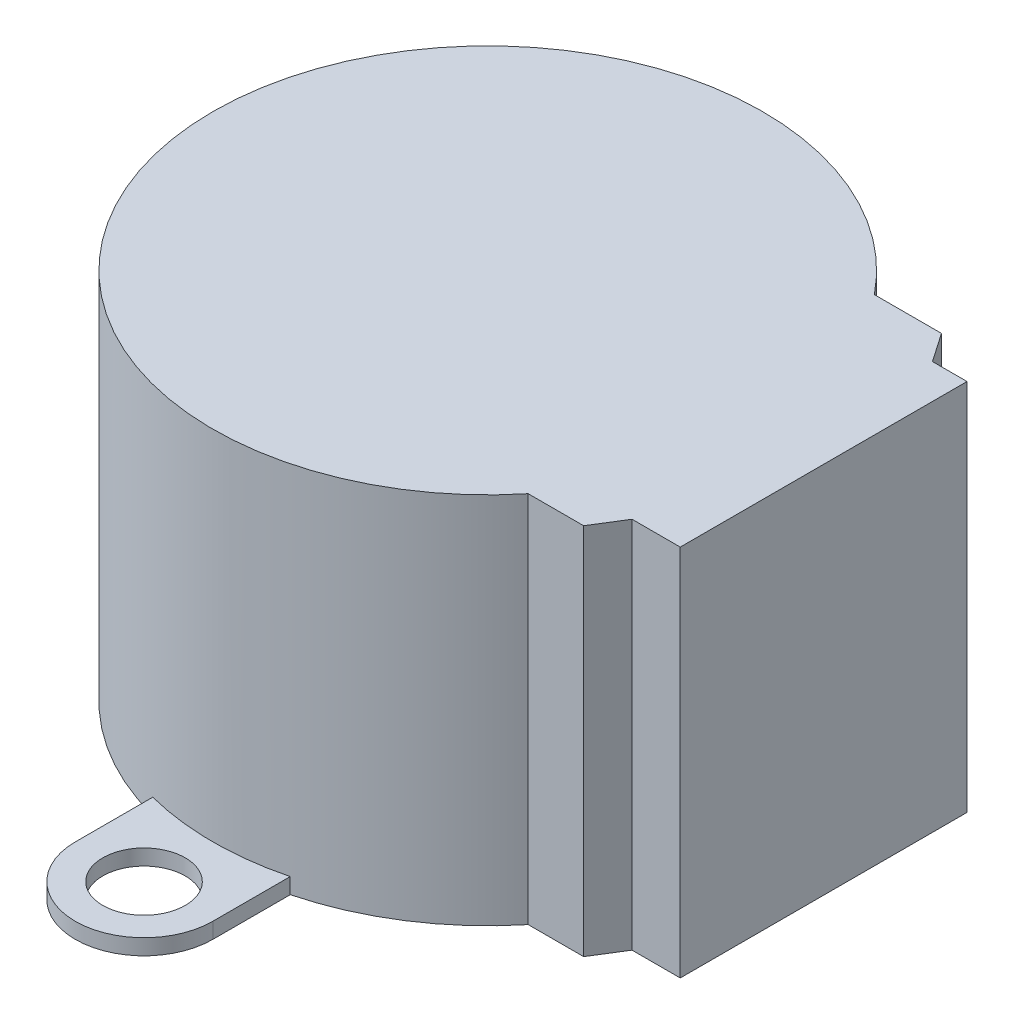
ISO-10303-21;
HEADER;
FILE_DESCRIPTION(('STEP AP214'),'2;1');
FILE_NAME('part.step','',(''),(''),'','','');
FILE_SCHEMA(('AUTOMOTIVE_DESIGN { 1 0 10303 214 1 1 1 1 }'));
ENDSEC;
DATA;
#1=APPLICATION_CONTEXT('core data for automotive mechanical design processes');
#2=APPLICATION_PROTOCOL_DEFINITION('international standard','automotive_design',2000,#1);
#3=PRODUCT_CONTEXT('',#1,'mechanical');
#4=PRODUCT('Part','Part','',(#3));
#5=PRODUCT_RELATED_PRODUCT_CATEGORY('part','',(#4));
#6=PRODUCT_DEFINITION_FORMATION('','',#4);
#7=PRODUCT_DEFINITION_CONTEXT('part definition',#1,'design');
#8=PRODUCT_DEFINITION('design','',#6,#7);
#9=PRODUCT_DEFINITION_SHAPE('','',#8);
#10=(LENGTH_UNIT() NAMED_UNIT(*) SI_UNIT(.MILLI.,.METRE.));
#11=(NAMED_UNIT(*) PLANE_ANGLE_UNIT() SI_UNIT($,.RADIAN.));
#12=(NAMED_UNIT(*) SI_UNIT($,.STERADIAN.) SOLID_ANGLE_UNIT());
#13=UNCERTAINTY_MEASURE_WITH_UNIT(LENGTH_MEASURE(1.E-05),#10,'distance_accuracy_value','');
#14=(GEOMETRIC_REPRESENTATION_CONTEXT(3) GLOBAL_UNCERTAINTY_ASSIGNED_CONTEXT((#13)) GLOBAL_UNIT_ASSIGNED_CONTEXT((#10,
#11,#12)) REPRESENTATION_CONTEXT('',''));
#15=CARTESIAN_POINT('',(0.,0.,0.));
#16=DIRECTION('',(0.,0.,1.));
#17=DIRECTION('',(1.,0.,0.));
#18=AXIS2_PLACEMENT_3D('',#15,#16,#17);
#19=CARTESIAN_POINT('',(0.,-4.,0.));
#20=DIRECTION('',(0.,1.,0.));
#21=DIRECTION('',(0.,0.,1.));
#22=AXIS2_PLACEMENT_3D('',#19,#20,#21);
#23=PLANE('',#22);
#24=CARTESIAN_POINT('',(-8.,-4.,0.));
#25=DIRECTION('',(0.,1.,0.));
#26=DIRECTION('',(0.,0.,1.));
#27=AXIS2_PLACEMENT_3D('',#24,#25,#26);
#28=CIRCLE('',#27,2.5);
#29=CARTESIAN_POINT('',(-6.98320476329011,-4.,-2.28388428923273));
#30=VERTEX_POINT('',#29);
#31=CARTESIAN_POINT('',(-9.01679523670988,-4.,-2.28388428923273));
#32=VERTEX_POINT('',#31);
#33=EDGE_CURVE('E216',#30,#32,#28,.T.);
#34=ORIENTED_EDGE('',*,*,#33,.F.);
#35=DIRECTION('',(1.,0.,0.));
#36=VECTOR('',#35,1.);
#37=CARTESIAN_POINT('',(-10.1451436156727,-4.,-2.28388428923273));
#38=LINE('',#37,#36);
#39=EDGE_CURVE('E55',#30,#32,#38,.F.);
#40=ORIENTED_EDGE('',*,*,#39,.T.);
#41=EDGE_LOOP('',(#34,#40));
#42=FACE_BOUND('',#41,.T.);
#43=ADVANCED_FACE('F36',(#42),#23,.F.);
#44=CARTESIAN_POINT('',(0.,19.,0.));
#45=DIRECTION('',(0.,-1.,0.));
#46=DIRECTION('',(0.,0.,-1.));
#47=AXIS2_PLACEMENT_3D('',#44,#45,#46);
#48=CYLINDRICAL_SURFACE('',#47,14.);
#49=CARTESIAN_POINT('',(0.,0.,0.));
#50=DIRECTION('',(0.,1.,0.));
#51=DIRECTION('',(0.,0.,1.));
#52=AXIS2_PLACEMENT_3D('',#49,#50,#51);
#53=CIRCLE('',#52,14.);
#54=CARTESIAN_POINT('',(-3.49999999999999,0.,-13.555441711726));
#55=VERTEX_POINT('',#54);
#56=CARTESIAN_POINT('',(-3.49999999999999,0.,13.555441711726));
#57=VERTEX_POINT('',#56);
#58=EDGE_CURVE('E413',#55,#57,#53,.T.);
#59=ORIENTED_EDGE('',*,*,#58,.T.);
#60=DIRECTION('',(0.,-1.,0.));
#61=VECTOR('',#60,1.);
#62=CARTESIAN_POINT('',(-3.49999999999999,0.8,13.555441711726));
#63=LINE('',#62,#61);
#64=CARTESIAN_POINT('',(-3.49999999999999,0.799999999999999,13.555441711726));
#65=VERTEX_POINT('',#64);
#66=EDGE_CURVE('E485',#65,#57,#63,.T.);
#67=ORIENTED_EDGE('',*,*,#66,.F.);
#68=CARTESIAN_POINT('',(0.,0.8,0.));
#69=DIRECTION('',(0.,1.,0.));
#70=DIRECTION('',(0.,0.,1.));
#71=AXIS2_PLACEMENT_3D('',#68,#69,#70);
#72=CIRCLE('',#71,14.);
#73=CARTESIAN_POINT('',(3.5,0.799999999999999,13.555441711726));
#74=VERTEX_POINT('',#73);
#75=EDGE_CURVE('E488',#65,#74,#72,.T.);
#76=ORIENTED_EDGE('',*,*,#75,.T.);
#77=DIRECTION('',(0.,-1.,0.));
#78=VECTOR('',#77,1.);
#79=CARTESIAN_POINT('',(3.5,0.8,13.555441711726));
#80=LINE('',#79,#78);
#81=CARTESIAN_POINT('',(3.5,0.,13.555441711726));
#82=VERTEX_POINT('',#81);
#83=EDGE_CURVE('E482',#74,#82,#80,.T.);
#84=ORIENTED_EDGE('',*,*,#83,.T.);
#85=CARTESIAN_POINT('',(10.8743002323448,0.,8.81757304800058));
#86=VERTEX_POINT('',#85);
#87=EDGE_CURVE('E414',#82,#86,#53,.T.);
#88=ORIENTED_EDGE('',*,*,#87,.T.);
#89=DIRECTION('',(0.,-1.,0.));
#90=VECTOR('',#89,1.);
#91=CARTESIAN_POINT('',(10.8743002323448,19.,8.81757304800058));
#92=LINE('',#91,#90);
#93=CARTESIAN_POINT('',(10.8743002323448,19.,8.81757304800058));
#94=VERTEX_POINT('',#93);
#95=EDGE_CURVE('E231',#94,#86,#92,.T.);
#96=ORIENTED_EDGE('',*,*,#95,.F.);
#97=CARTESIAN_POINT('',(0.,19.,0.));
#98=DIRECTION('',(0.,1.,0.));
#99=DIRECTION('',(0.,0.,1.));
#100=AXIS2_PLACEMENT_3D('',#97,#98,#99);
#101=CIRCLE('',#100,14.);
#102=CARTESIAN_POINT('',(10.9116716316614,19.,-8.77128395406261));
#103=VERTEX_POINT('',#102);
#104=EDGE_CURVE('E394',#103,#94,#101,.T.);
#105=ORIENTED_EDGE('',*,*,#104,.F.);
#106=DIRECTION('',(0.,-1.,0.));
#107=VECTOR('',#106,1.);
#108=CARTESIAN_POINT('',(10.9116716316614,19.,-8.77128395406261));
#109=LINE('',#108,#107);
#110=CARTESIAN_POINT('',(10.9116716316614,0.,-8.77128395406261));
#111=VERTEX_POINT('',#110);
#112=EDGE_CURVE('E388',#103,#111,#109,.T.);
#113=ORIENTED_EDGE('',*,*,#112,.T.);
#114=CARTESIAN_POINT('',(3.5,0.,-13.555441711726));
#115=VERTEX_POINT('',#114);
#116=EDGE_CURVE('E411',#111,#115,#53,.T.);
#117=ORIENTED_EDGE('',*,*,#116,.T.);
#118=DIRECTION('',(0.,-1.,0.));
#119=VECTOR('',#118,1.);
#120=CARTESIAN_POINT('',(3.5,0.8,-13.555441711726));
#121=LINE('',#120,#119);
#122=CARTESIAN_POINT('',(3.5,0.799999999999999,-13.555441711726));
#123=VERTEX_POINT('',#122);
#124=EDGE_CURVE('E448',#123,#115,#121,.T.);
#125=ORIENTED_EDGE('',*,*,#124,.F.);
#126=CARTESIAN_POINT('',(0.,0.8,0.));
#127=DIRECTION('',(0.,1.,0.));
#128=DIRECTION('',(0.,0.,1.));
#129=AXIS2_PLACEMENT_3D('',#126,#127,#128);
#130=CIRCLE('',#129,14.);
#131=CARTESIAN_POINT('',(-3.49999999999999,0.799999999999999,-13.555441711726));
#132=VERTEX_POINT('',#131);
#133=EDGE_CURVE('E451',#123,#132,#130,.T.);
#134=ORIENTED_EDGE('',*,*,#133,.T.);
#135=DIRECTION('',(0.,-1.,0.));
#136=VECTOR('',#135,1.);
#137=CARTESIAN_POINT('',(-3.49999999999999,0.8,-13.555441711726));
#138=LINE('',#137,#136);
#139=EDGE_CURVE('E445',#132,#55,#138,.T.);
#140=ORIENTED_EDGE('',*,*,#139,.T.);
#141=EDGE_LOOP('',(#59,#67,#76,#84,#88,#96,#105,#113,#117,#125,#134,#140));
#142=FACE_BOUND('',#141,.T.);
#143=ADVANCED_FACE('F268',(#142),#48,.T.);
#144=CARTESIAN_POINT('',(0.,19.,8.81757304800058));
#145=DIRECTION('',(0.,0.,-1.));
#146=DIRECTION('',(-1.,0.,0.));
#147=AXIS2_PLACEMENT_3D('',#144,#145,#146);
#148=PLANE('',#147);
#149=DIRECTION('',(1.,0.,0.));
#150=VECTOR('',#149,1.);
#151=CARTESIAN_POINT('',(0.,0.,8.81757304800058));
#152=LINE('',#151,#150);
#153=CARTESIAN_POINT('',(13.7006228905011,0.,8.81757304800058));
#154=VERTEX_POINT('',#153);
#155=EDGE_CURVE('E409',#86,#154,#152,.T.);
#156=ORIENTED_EDGE('',*,*,#155,.T.);
#157=DIRECTION('',(0.,-1.,0.));
#158=VECTOR('',#157,1.);
#159=CARTESIAN_POINT('',(13.7006228905011,19.,8.81757304800058));
#160=LINE('',#159,#158);
#161=CARTESIAN_POINT('',(13.7006228905011,19.,8.81757304800058));
#162=VERTEX_POINT('',#161);
#163=EDGE_CURVE('E370',#162,#154,#160,.T.);
#164=ORIENTED_EDGE('',*,*,#163,.F.);
#165=DIRECTION('',(1.,0.,0.));
#166=VECTOR('',#165,1.);
#167=CARTESIAN_POINT('',(0.,19.,8.81757304800058));
#168=LINE('',#167,#166);
#169=EDGE_CURVE('E430',#94,#162,#168,.T.);
#170=ORIENTED_EDGE('',*,*,#169,.F.);
#171=ORIENTED_EDGE('',*,*,#95,.T.);
#172=EDGE_LOOP('',(#156,#164,#170,#171));
#173=FACE_BOUND('',#172,.T.);
#174=ADVANCED_FACE('F272',(#173),#148,.F.);
#175=CARTESIAN_POINT('',(13.8310384443129,19.,8.60802646423938));
#176=DIRECTION('',(-0.849000236853081,0.,-0.528392465714087));
#177=DIRECTION('',(-0.528392465714087,0.,0.849000236853081));
#178=AXIS2_PLACEMENT_3D('',#175,#176,#177);
#179=PLANE('',#178);
#180=DIRECTION('',(0.528392465714087,0.,-0.849000236853081));
#181=VECTOR('',#180,1.);
#182=CARTESIAN_POINT('',(13.8310384443129,0.,8.60802646423938));
#183=LINE('',#182,#181);
#184=CARTESIAN_POINT('',(14.645115164975,0.,7.3));
#185=VERTEX_POINT('',#184);
#186=EDGE_CURVE('E407',#154,#185,#183,.T.);
#187=ORIENTED_EDGE('',*,*,#186,.T.);
#188=DIRECTION('',(0.,-1.,0.));
#189=VECTOR('',#188,1.);
#190=CARTESIAN_POINT('',(14.645115164975,19.,7.3));
#191=LINE('',#190,#189);
#192=CARTESIAN_POINT('',(14.645115164975,19.,7.3));
#193=VERTEX_POINT('',#192);
#194=EDGE_CURVE('E373',#193,#185,#191,.T.);
#195=ORIENTED_EDGE('',*,*,#194,.F.);
#196=DIRECTION('',(0.528392465714087,0.,-0.849000236853081));
#197=VECTOR('',#196,1.);
#198=CARTESIAN_POINT('',(13.8310384443129,19.,8.60802646423938));
#199=LINE('',#198,#197);
#200=EDGE_CURVE('E428',#162,#193,#199,.T.);
#201=ORIENTED_EDGE('',*,*,#200,.F.);
#202=ORIENTED_EDGE('',*,*,#163,.T.);
#203=EDGE_LOOP('',(#187,#195,#201,#202));
#204=FACE_BOUND('',#203,.T.);
#205=ADVANCED_FACE('F276',(#204),#179,.F.);
#206=CARTESIAN_POINT('',(0.,19.,7.3));
#207=DIRECTION('',(0.,0.,-1.));
#208=DIRECTION('',(-1.,0.,0.));
#209=AXIS2_PLACEMENT_3D('',#206,#207,#208);
#210=PLANE('',#209);
#211=DIRECTION('',(1.,0.,0.));
#212=VECTOR('',#211,1.);
#213=CARTESIAN_POINT('',(0.,0.,7.3));
#214=LINE('',#213,#212);
#215=CARTESIAN_POINT('',(17.1,0.,7.3));
#216=VERTEX_POINT('',#215);
#217=EDGE_CURVE('E404',#185,#216,#214,.T.);
#218=ORIENTED_EDGE('',*,*,#217,.T.);
#219=DIRECTION('',(0.,-1.,0.));
#220=VECTOR('',#219,1.);
#221=CARTESIAN_POINT('',(17.1,19.,7.3));
#222=LINE('',#221,#220);
#223=CARTESIAN_POINT('',(17.1,19.,7.3));
#224=VERTEX_POINT('',#223);
#225=EDGE_CURVE('E378',#224,#216,#222,.T.);
#226=ORIENTED_EDGE('',*,*,#225,.F.);
#227=DIRECTION('',(1.,0.,0.));
#228=VECTOR('',#227,1.);
#229=CARTESIAN_POINT('',(0.,19.,7.3));
#230=LINE('',#229,#228);
#231=EDGE_CURVE('E426',#193,#224,#230,.T.);
#232=ORIENTED_EDGE('',*,*,#231,.F.);
#233=ORIENTED_EDGE('',*,*,#194,.T.);
#234=EDGE_LOOP('',(#218,#226,#232,#233));
#235=FACE_BOUND('',#234,.T.);
#236=ADVANCED_FACE('F280',(#235),#210,.F.);
#237=CARTESIAN_POINT('',(17.1,19.,0.));
#238=DIRECTION('',(1.,0.,0.));
#239=DIRECTION('',(0.,0.,-1.));
#240=AXIS2_PLACEMENT_3D('',#237,#238,#239);
#241=PLANE('',#240);
#242=DIRECTION('',(0.,0.,1.));
#243=VECTOR('',#242,1.);
#244=CARTESIAN_POINT('',(17.1,0.,0.));
#245=LINE('',#244,#243);
#246=CARTESIAN_POINT('',(17.1,0.,-7.3));
#247=VERTEX_POINT('',#246);
#248=EDGE_CURVE('E401',#247,#216,#245,.T.);
#249=ORIENTED_EDGE('',*,*,#248,.F.);
#250=DIRECTION('',(0.,-1.,0.));
#251=VECTOR('',#250,1.);
#252=CARTESIAN_POINT('',(17.1,19.,-7.3));
#253=LINE('',#252,#251);
#254=CARTESIAN_POINT('',(17.1,19.,-7.3));
#255=VERTEX_POINT('',#254);
#256=EDGE_CURVE('E382',#255,#247,#253,.T.);
#257=ORIENTED_EDGE('',*,*,#256,.F.);
#258=DIRECTION('',(0.,0.,1.));
#259=VECTOR('',#258,1.);
#260=CARTESIAN_POINT('',(17.1,19.,0.));
#261=LINE('',#260,#259);
#262=EDGE_CURVE('E423',#255,#224,#261,.T.);
#263=ORIENTED_EDGE('',*,*,#262,.T.);
#264=ORIENTED_EDGE('',*,*,#225,.T.);
#265=EDGE_LOOP('',(#249,#257,#263,#264));
#266=FACE_BOUND('',#265,.T.);
#267=ADVANCED_FACE('F284',(#266),#241,.T.);
#268=CARTESIAN_POINT('',(0.,19.,-7.3));
#269=DIRECTION('',(0.,0.,-1.));
#270=DIRECTION('',(-1.,0.,0.));
#271=AXIS2_PLACEMENT_3D('',#268,#269,#270);
#272=PLANE('',#271);
#273=DIRECTION('',(1.,0.,0.));
#274=VECTOR('',#273,1.);
#275=CARTESIAN_POINT('',(0.,0.,-7.3));
#276=LINE('',#275,#274);
#277=CARTESIAN_POINT('',(15.3419038986928,0.,-7.3));
#278=VERTEX_POINT('',#277);
#279=EDGE_CURVE('E398',#278,#247,#276,.T.);
#280=ORIENTED_EDGE('',*,*,#279,.F.);
#281=DIRECTION('',(0.,-1.,0.));
#282=VECTOR('',#281,1.);
#283=CARTESIAN_POINT('',(15.3419038986928,19.,-7.3));
#284=LINE('',#283,#282);
#285=CARTESIAN_POINT('',(15.3419038986928,19.,-7.3));
#286=VERTEX_POINT('',#285);
#287=EDGE_CURVE('E384',#286,#278,#284,.T.);
#288=ORIENTED_EDGE('',*,*,#287,.F.);
#289=DIRECTION('',(1.,0.,0.));
#290=VECTOR('',#289,1.);
#291=CARTESIAN_POINT('',(0.,19.,-7.3));
#292=LINE('',#291,#290);
#293=EDGE_CURVE('E420',#286,#255,#292,.T.);
#294=ORIENTED_EDGE('',*,*,#293,.T.);
#295=ORIENTED_EDGE('',*,*,#256,.T.);
#296=EDGE_LOOP('',(#280,#288,#294,#295));
#297=FACE_BOUND('',#296,.T.);
#298=ADVANCED_FACE('F288',(#297),#272,.T.);
#299=CARTESIAN_POINT('',(13.8064040561496,19.,-9.52556220750878));
#300=DIRECTION('',(0.823103986409762,0.,-0.567890682751847));
#301=DIRECTION('',(-0.567890682751847,0.,-0.823103986409762));
#302=AXIS2_PLACEMENT_3D('',#299,#300,#301);
#303=PLANE('',#302);
#304=DIRECTION('',(0.567890682751847,0.,0.823103986409762));
#305=VECTOR('',#304,1.);
#306=CARTESIAN_POINT('',(13.8064040561496,0.,-9.52556220750878));
#307=LINE('',#306,#305);
#308=CARTESIAN_POINT('',(14.326809253314,0.,-8.77128395406261));
#309=VERTEX_POINT('',#308);
#310=EDGE_CURVE('E395',#309,#278,#307,.T.);
#311=ORIENTED_EDGE('',*,*,#310,.F.);
#312=DIRECTION('',(0.,-1.,0.));
#313=VECTOR('',#312,1.);
#314=CARTESIAN_POINT('',(14.326809253314,19.,-8.77128395406261));
#315=LINE('',#314,#313);
#316=CARTESIAN_POINT('',(14.326809253314,19.,-8.77128395406261));
#317=VERTEX_POINT('',#316);
#318=EDGE_CURVE('E386',#317,#309,#315,.T.);
#319=ORIENTED_EDGE('',*,*,#318,.F.);
#320=DIRECTION('',(0.567890682751847,0.,0.823103986409762));
#321=VECTOR('',#320,1.);
#322=CARTESIAN_POINT('',(13.8064040561496,19.,-9.52556220750878));
#323=LINE('',#322,#321);
#324=EDGE_CURVE('E417',#317,#286,#323,.T.);
#325=ORIENTED_EDGE('',*,*,#324,.T.);
#326=ORIENTED_EDGE('',*,*,#287,.T.);
#327=EDGE_LOOP('',(#311,#319,#325,#326));
#328=FACE_BOUND('',#327,.T.);
#329=ADVANCED_FACE('F292',(#328),#303,.T.);
#330=CARTESIAN_POINT('',(0.,19.,-8.77128395406261));
#331=DIRECTION('',(0.,0.,-1.));
#332=DIRECTION('',(-1.,0.,0.));
#333=AXIS2_PLACEMENT_3D('',#330,#331,#332);
#334=PLANE('',#333);
#335=DIRECTION('',(1.,0.,0.));
#336=VECTOR('',#335,1.);
#337=CARTESIAN_POINT('',(0.,0.,-8.77128395406261));
#338=LINE('',#337,#336);
#339=EDGE_CURVE('E391',#111,#309,#338,.T.);
#340=ORIENTED_EDGE('',*,*,#339,.F.);
#341=ORIENTED_EDGE('',*,*,#112,.F.);
#342=DIRECTION('',(1.,0.,0.));
#343=VECTOR('',#342,1.);
#344=CARTESIAN_POINT('',(0.,19.,-8.77128395406261));
#345=LINE('',#344,#343);
#346=EDGE_CURVE('E390',#103,#317,#345,.T.);
#347=ORIENTED_EDGE('',*,*,#346,.T.);
#348=ORIENTED_EDGE('',*,*,#318,.T.);
#349=EDGE_LOOP('',(#340,#341,#347,#348));
#350=FACE_BOUND('',#349,.T.);
#351=ADVANCED_FACE('F296',(#350),#334,.T.);
#352=CARTESIAN_POINT('',(0.,19.,0.));
#353=DIRECTION('',(0.,1.,0.));
#354=DIRECTION('',(0.,0.,1.));
#355=AXIS2_PLACEMENT_3D('',#352,#353,#354);
#356=PLANE('',#355);
#357=ORIENTED_EDGE('',*,*,#104,.T.);
#358=ORIENTED_EDGE('',*,*,#169,.T.);
#359=ORIENTED_EDGE('',*,*,#200,.T.);
#360=ORIENTED_EDGE('',*,*,#231,.T.);
#361=ORIENTED_EDGE('',*,*,#262,.F.);
#362=ORIENTED_EDGE('',*,*,#293,.F.);
#363=ORIENTED_EDGE('',*,*,#324,.F.);
#364=ORIENTED_EDGE('',*,*,#346,.F.);
#365=EDGE_LOOP('',(#357,#358,#359,#360,#361,#362,#363,#364));
#366=FACE_BOUND('',#365,.T.);
#367=ADVANCED_FACE('F300',(#366),#356,.T.);
#368=CARTESIAN_POINT('',(0.,0.,0.));
#369=DIRECTION('',(0.,1.,0.));
#370=DIRECTION('',(0.,0.,1.));
#371=AXIS2_PLACEMENT_3D('',#368,#369,#370);
#372=PLANE('',#371);
#373=CARTESIAN_POINT('',(-8.,0.,0.));
#374=DIRECTION('',(0.,1.,0.));
#375=DIRECTION('',(0.,0.,1.));
#376=AXIS2_PLACEMENT_3D('',#373,#374,#375);
#377=CIRCLE('',#376,4.5);
#378=CARTESIAN_POINT('',(-8.,0.,4.5));
#379=VERTEX_POINT('',#378);
#380=EDGE_CURVE('E434',#379,#379,#377,.T.);
#381=ORIENTED_EDGE('',*,*,#380,.T.);
#382=EDGE_LOOP('',(#381));
#383=FACE_BOUND('',#382,.T.);
#384=ORIENTED_EDGE('',*,*,#116,.F.);
#385=ORIENTED_EDGE('',*,*,#339,.T.);
#386=ORIENTED_EDGE('',*,*,#310,.T.);
#387=ORIENTED_EDGE('',*,*,#279,.T.);
#388=ORIENTED_EDGE('',*,*,#248,.T.);
#389=ORIENTED_EDGE('',*,*,#217,.F.);
#390=ORIENTED_EDGE('',*,*,#186,.F.);
#391=ORIENTED_EDGE('',*,*,#155,.F.);
#392=ORIENTED_EDGE('',*,*,#87,.F.);
#393=DIRECTION('',(0.,0.,-1.));
#394=VECTOR('',#393,1.);
#395=CARTESIAN_POINT('',(3.5,0.,0.));
#396=LINE('',#395,#394);
#397=CARTESIAN_POINT('',(3.5,0.,17.5));
#398=VERTEX_POINT('',#397);
#399=EDGE_CURVE('E489',#398,#82,#396,.T.);
#400=ORIENTED_EDGE('',*,*,#399,.F.);
#401=CARTESIAN_POINT('',(0.,0.,17.5));
#402=DIRECTION('',(0.,1.,0.));
#403=DIRECTION('',(0.,0.,1.));
#404=AXIS2_PLACEMENT_3D('',#401,#402,#403);
#405=CIRCLE('',#404,3.5);
#406=CARTESIAN_POINT('',(-3.49999999999999,0.,17.5));
#407=VERTEX_POINT('',#406);
#408=EDGE_CURVE('E492',#407,#398,#405,.T.);
#409=ORIENTED_EDGE('',*,*,#408,.F.);
#410=DIRECTION('',(0.,0.,-1.));
#411=VECTOR('',#410,1.);
#412=CARTESIAN_POINT('',(-3.49999999999999,0.,0.));
#413=LINE('',#412,#411);
#414=EDGE_CURVE('E495',#407,#57,#413,.T.);
#415=ORIENTED_EDGE('',*,*,#414,.T.);
#416=ORIENTED_EDGE('',*,*,#58,.F.);
#417=DIRECTION('',(0.,0.,1.));
#418=VECTOR('',#417,1.);
#419=CARTESIAN_POINT('',(-3.49999999999997,0.,0.));
#420=LINE('',#419,#418);
#421=CARTESIAN_POINT('',(-3.5,0.,-17.5));
#422=VERTEX_POINT('',#421);
#423=EDGE_CURVE('E452',#422,#55,#420,.T.);
#424=ORIENTED_EDGE('',*,*,#423,.F.);
#425=CARTESIAN_POINT('',(0.,0.,-17.5));
#426=DIRECTION('',(0.,1.,0.));
#427=DIRECTION('',(0.,0.,1.));
#428=AXIS2_PLACEMENT_3D('',#425,#426,#427);
#429=CIRCLE('',#428,3.5);
#430=CARTESIAN_POINT('',(3.5,0.,-17.5));
#431=VERTEX_POINT('',#430);
#432=EDGE_CURVE('E456',#431,#422,#429,.T.);
#433=ORIENTED_EDGE('',*,*,#432,.F.);
#434=DIRECTION('',(0.,0.,1.));
#435=VECTOR('',#434,1.);
#436=CARTESIAN_POINT('',(3.5,0.,0.));
#437=LINE('',#436,#435);
#438=EDGE_CURVE('E459',#431,#115,#437,.T.);
#439=ORIENTED_EDGE('',*,*,#438,.T.);
#440=EDGE_LOOP('',(#384,#385,#386,#387,#388,#389,#390,#391,#392,#400,#409,#415,#416,#424,#433,#439));
#441=FACE_BOUND('',#440,.T.);
#442=CARTESIAN_POINT('',(0.,0.,-17.5));
#443=DIRECTION('',(0.,1.,0.));
#444=DIRECTION('',(0.,0.,1.));
#445=AXIS2_PLACEMENT_3D('',#442,#443,#444);
#446=CIRCLE('',#445,2.1);
#447=CARTESIAN_POINT('',(0.,0.,-15.4));
#448=VERTEX_POINT('',#447);
#449=EDGE_CURVE('E462',#448,#448,#446,.T.);
#450=ORIENTED_EDGE('',*,*,#449,.T.);
#451=EDGE_LOOP('',(#450));
#452=FACE_BOUND('',#451,.T.);
#453=CARTESIAN_POINT('',(0.,0.,17.5));
#454=DIRECTION('',(0.,1.,0.));
#455=DIRECTION('',(0.,0.,1.));
#456=AXIS2_PLACEMENT_3D('',#453,#454,#455);
#457=CIRCLE('',#456,2.1);
#458=CARTESIAN_POINT('',(0.,0.,19.6));
#459=VERTEX_POINT('',#458);
#460=EDGE_CURVE('E498',#459,#459,#457,.T.);
#461=ORIENTED_EDGE('',*,*,#460,.T.);
#462=EDGE_LOOP('',(#461));
#463=FACE_BOUND('',#462,.T.);
#464=ADVANCED_FACE('F302',(#383,#441,#452,#463),#372,.F.);
#465=CARTESIAN_POINT('',(-8.,-1.6,0.));
#466=DIRECTION('',(0.,1.,0.));
#467=DIRECTION('',(0.,0.,1.));
#468=AXIS2_PLACEMENT_3D('',#465,#466,#467);
#469=CYLINDRICAL_SURFACE('',#468,4.5);
#470=CARTESIAN_POINT('',(-8.,-1.6,0.));
#471=DIRECTION('',(0.,1.,0.));
#472=DIRECTION('',(0.,0.,1.));
#473=AXIS2_PLACEMENT_3D('',#470,#471,#472);
#474=CIRCLE('',#473,4.5);
#475=CARTESIAN_POINT('',(-8.,-1.6,4.5));
#476=VERTEX_POINT('',#475);
#477=EDGE_CURVE('E437',#476,#476,#474,.T.);
#478=ORIENTED_EDGE('',*,*,#477,.T.);
#479=EDGE_LOOP('',(#478));
#480=FACE_BOUND('',#479,.T.);
#481=ORIENTED_EDGE('',*,*,#380,.F.);
#482=EDGE_LOOP('',(#481));
#483=FACE_BOUND('',#482,.T.);
#484=ADVANCED_FACE('F305',(#480,#483),#469,.T.);
#485=CARTESIAN_POINT('',(0.,-1.6,0.));
#486=DIRECTION('',(0.,1.,0.));
#487=DIRECTION('',(0.,0.,1.));
#488=AXIS2_PLACEMENT_3D('',#485,#486,#487);
#489=PLANE('',#488);
#490=CARTESIAN_POINT('',(-8.,-1.6,0.));
#491=DIRECTION('',(0.,1.,0.));
#492=DIRECTION('',(0.,0.,1.));
#493=AXIS2_PLACEMENT_3D('',#490,#491,#492);
#494=CIRCLE('',#493,2.5);
#495=CARTESIAN_POINT('',(-8.,-1.6,2.5));
#496=VERTEX_POINT('',#495);
#497=EDGE_CURVE('E238',#496,#496,#494,.T.);
#498=ORIENTED_EDGE('',*,*,#497,.T.);
#499=EDGE_LOOP('',(#498));
#500=FACE_BOUND('',#499,.T.);
#501=ORIENTED_EDGE('',*,*,#477,.F.);
#502=EDGE_LOOP('',(#501));
#503=FACE_BOUND('',#502,.T.);
#504=ADVANCED_FACE('F312',(#500,#503),#489,.F.);
#505=CARTESIAN_POINT('',(3.5,0.8,0.));
#506=DIRECTION('',(1.,0.,0.));
#507=DIRECTION('',(0.,0.,-1.));
#508=AXIS2_PLACEMENT_3D('',#505,#506,#507);
#509=PLANE('',#508);
#510=ORIENTED_EDGE('',*,*,#438,.F.);
#511=DIRECTION('',(0.,-1.,0.));
#512=VECTOR('',#511,1.);
#513=CARTESIAN_POINT('',(3.5,0.8,-17.5));
#514=LINE('',#513,#512);
#515=CARTESIAN_POINT('',(3.5,0.8,-17.5));
#516=VERTEX_POINT('',#515);
#517=EDGE_CURVE('E438',#516,#431,#514,.T.);
#518=ORIENTED_EDGE('',*,*,#517,.F.);
#519=DIRECTION('',(0.,0.,1.));
#520=VECTOR('',#519,1.);
#521=CARTESIAN_POINT('',(3.5,0.8,0.));
#522=LINE('',#521,#520);
#523=EDGE_CURVE('E473',#516,#123,#522,.T.);
#524=ORIENTED_EDGE('',*,*,#523,.T.);
#525=ORIENTED_EDGE('',*,*,#124,.T.);
#526=EDGE_LOOP('',(#510,#518,#524,#525));
#527=FACE_BOUND('',#526,.T.);
#528=ADVANCED_FACE('F316',(#527),#509,.T.);
#529=CARTESIAN_POINT('',(0.,0.8,-17.5));
#530=DIRECTION('',(0.,-1.,0.));
#531=DIRECTION('',(0.,0.,-1.));
#532=AXIS2_PLACEMENT_3D('',#529,#530,#531);
#533=CYLINDRICAL_SURFACE('',#532,3.5);
#534=ORIENTED_EDGE('',*,*,#432,.T.);
#535=DIRECTION('',(0.,-1.,0.));
#536=VECTOR('',#535,1.);
#537=CARTESIAN_POINT('',(-3.5,0.8,-17.5));
#538=LINE('',#537,#536);
#539=CARTESIAN_POINT('',(-3.5,0.8,-17.5));
#540=VERTEX_POINT('',#539);
#541=EDGE_CURVE('E442',#540,#422,#538,.T.);
#542=ORIENTED_EDGE('',*,*,#541,.F.);
#543=CARTESIAN_POINT('',(0.,0.8,-17.5));
#544=DIRECTION('',(0.,1.,0.));
#545=DIRECTION('',(0.,0.,1.));
#546=AXIS2_PLACEMENT_3D('',#543,#544,#545);
#547=CIRCLE('',#546,3.5);
#548=EDGE_CURVE('E470',#516,#540,#547,.T.);
#549=ORIENTED_EDGE('',*,*,#548,.F.);
#550=ORIENTED_EDGE('',*,*,#517,.T.);
#551=EDGE_LOOP('',(#534,#542,#549,#550));
#552=FACE_BOUND('',#551,.T.);
#553=ADVANCED_FACE('F326',(#552),#533,.T.);
#554=CARTESIAN_POINT('',(-3.49999999999997,0.8,0.));
#555=DIRECTION('',(1.,0.,0.));
#556=DIRECTION('',(0.,0.,-1.));
#557=AXIS2_PLACEMENT_3D('',#554,#555,#556);
#558=PLANE('',#557);
#559=ORIENTED_EDGE('',*,*,#423,.T.);
#560=ORIENTED_EDGE('',*,*,#139,.F.);
#561=DIRECTION('',(0.,0.,1.));
#562=VECTOR('',#561,1.);
#563=CARTESIAN_POINT('',(-3.49999999999997,0.8,0.));
#564=LINE('',#563,#562);
#565=EDGE_CURVE('E467',#540,#132,#564,.T.);
#566=ORIENTED_EDGE('',*,*,#565,.F.);
#567=ORIENTED_EDGE('',*,*,#541,.T.);
#568=EDGE_LOOP('',(#559,#560,#566,#567));
#569=FACE_BOUND('',#568,.T.);
#570=ADVANCED_FACE('F322',(#569),#558,.F.);
#571=CARTESIAN_POINT('',(0.,0.8,-17.5));
#572=DIRECTION('',(0.,-1.,0.));
#573=DIRECTION('',(0.,0.,-1.));
#574=AXIS2_PLACEMENT_3D('',#571,#572,#573);
#575=CYLINDRICAL_SURFACE('',#574,2.1);
#576=CARTESIAN_POINT('',(0.,0.8,-17.5));
#577=DIRECTION('',(0.,1.,0.));
#578=DIRECTION('',(0.,0.,1.));
#579=AXIS2_PLACEMENT_3D('',#576,#577,#578);
#580=CIRCLE('',#579,2.1);
#581=CARTESIAN_POINT('',(0.,0.8,-15.4));
#582=VERTEX_POINT('',#581);
#583=EDGE_CURVE('E455',#582,#582,#580,.T.);
#584=ORIENTED_EDGE('',*,*,#583,.T.);
#585=EDGE_LOOP('',(#584));
#586=FACE_BOUND('',#585,.T.);
#587=ORIENTED_EDGE('',*,*,#449,.F.);
#588=EDGE_LOOP('',(#587));
#589=FACE_BOUND('',#588,.T.);
#590=ADVANCED_FACE('F318',(#586,#589),#575,.F.);
#591=CARTESIAN_POINT('',(0.,0.8,0.));
#592=DIRECTION('',(0.,1.,0.));
#593=DIRECTION('',(0.,0.,1.));
#594=AXIS2_PLACEMENT_3D('',#591,#592,#593);
#595=PLANE('',#594);
#596=ORIENTED_EDGE('',*,*,#583,.F.);
#597=EDGE_LOOP('',(#596));
#598=FACE_BOUND('',#597,.T.);
#599=ORIENTED_EDGE('',*,*,#523,.F.);
#600=ORIENTED_EDGE('',*,*,#548,.T.);
#601=ORIENTED_EDGE('',*,*,#565,.T.);
#602=ORIENTED_EDGE('',*,*,#133,.F.);
#603=EDGE_LOOP('',(#599,#600,#601,#602));
#604=FACE_BOUND('',#603,.T.);
#605=ADVANCED_FACE('F321',(#598,#604),#595,.T.);
#606=CARTESIAN_POINT('',(-3.49999999999999,0.8,0.));
#607=DIRECTION('',(-1.,0.,0.));
#608=DIRECTION('',(0.,0.,1.));
#609=AXIS2_PLACEMENT_3D('',#606,#607,#608);
#610=PLANE('',#609);
#611=ORIENTED_EDGE('',*,*,#414,.F.);
#612=DIRECTION('',(0.,-1.,0.));
#613=VECTOR('',#612,1.);
#614=CARTESIAN_POINT('',(-3.49999999999999,0.8,17.5));
#615=LINE('',#614,#613);
#616=CARTESIAN_POINT('',(-3.49999999999999,0.8,17.5));
#617=VERTEX_POINT('',#616);
#618=EDGE_CURVE('E465',#617,#407,#615,.T.);
#619=ORIENTED_EDGE('',*,*,#618,.F.);
#620=DIRECTION('',(0.,0.,-1.));
#621=VECTOR('',#620,1.);
#622=CARTESIAN_POINT('',(-3.49999999999999,0.8,0.));
#623=LINE('',#622,#621);
#624=EDGE_CURVE('E508',#617,#65,#623,.T.);
#625=ORIENTED_EDGE('',*,*,#624,.T.);
#626=ORIENTED_EDGE('',*,*,#66,.T.);
#627=EDGE_LOOP('',(#611,#619,#625,#626));
#628=FACE_BOUND('',#627,.T.);
#629=ADVANCED_FACE('F336',(#628),#610,.T.);
#630=CARTESIAN_POINT('',(0.,0.8,17.5));
#631=DIRECTION('',(0.,-1.,0.));
#632=DIRECTION('',(0.,0.,-1.));
#633=AXIS2_PLACEMENT_3D('',#630,#631,#632);
#634=CYLINDRICAL_SURFACE('',#633,3.5);
#635=ORIENTED_EDGE('',*,*,#408,.T.);
#636=DIRECTION('',(0.,-1.,0.));
#637=VECTOR('',#636,1.);
#638=CARTESIAN_POINT('',(3.5,0.8,17.5));
#639=LINE('',#638,#637);
#640=CARTESIAN_POINT('',(3.5,0.8,17.5));
#641=VERTEX_POINT('',#640);
#642=EDGE_CURVE('E479',#641,#398,#639,.T.);
#643=ORIENTED_EDGE('',*,*,#642,.F.);
#644=CARTESIAN_POINT('',(0.,0.8,17.5));
#645=DIRECTION('',(0.,1.,0.));
#646=DIRECTION('',(0.,0.,1.));
#647=AXIS2_PLACEMENT_3D('',#644,#645,#646);
#648=CIRCLE('',#647,3.5);
#649=EDGE_CURVE('E505',#617,#641,#648,.T.);
#650=ORIENTED_EDGE('',*,*,#649,.F.);
#651=ORIENTED_EDGE('',*,*,#618,.T.);
#652=EDGE_LOOP('',(#635,#643,#650,#651));
#653=FACE_BOUND('',#652,.T.);
#654=ADVANCED_FACE('F345',(#653),#634,.T.);
#655=CARTESIAN_POINT('',(3.5,0.8,0.));
#656=DIRECTION('',(-1.,0.,0.));
#657=DIRECTION('',(0.,0.,1.));
#658=AXIS2_PLACEMENT_3D('',#655,#656,#657);
#659=PLANE('',#658);
#660=ORIENTED_EDGE('',*,*,#399,.T.);
#661=ORIENTED_EDGE('',*,*,#83,.F.);
#662=DIRECTION('',(0.,0.,-1.));
#663=VECTOR('',#662,1.);
#664=CARTESIAN_POINT('',(3.5,0.8,0.));
#665=LINE('',#664,#663);
#666=EDGE_CURVE('E502',#641,#74,#665,.T.);
#667=ORIENTED_EDGE('',*,*,#666,.F.);
#668=ORIENTED_EDGE('',*,*,#642,.T.);
#669=EDGE_LOOP('',(#660,#661,#667,#668));
#670=FACE_BOUND('',#669,.T.);
#671=ADVANCED_FACE('F341',(#670),#659,.F.);
#672=CARTESIAN_POINT('',(0.,0.8,17.5));
#673=DIRECTION('',(0.,-1.,0.));
#674=DIRECTION('',(0.,0.,-1.));
#675=AXIS2_PLACEMENT_3D('',#672,#673,#674);
#676=CYLINDRICAL_SURFACE('',#675,2.1);
#677=CARTESIAN_POINT('',(0.,0.8,17.5));
#678=DIRECTION('',(0.,1.,0.));
#679=DIRECTION('',(0.,0.,1.));
#680=AXIS2_PLACEMENT_3D('',#677,#678,#679);
#681=CIRCLE('',#680,2.1);
#682=CARTESIAN_POINT('',(0.,0.8,19.6));
#683=VERTEX_POINT('',#682);
#684=EDGE_CURVE('E491',#683,#683,#681,.T.);
#685=ORIENTED_EDGE('',*,*,#684,.T.);
#686=EDGE_LOOP('',(#685));
#687=FACE_BOUND('',#686,.T.);
#688=ORIENTED_EDGE('',*,*,#460,.F.);
#689=EDGE_LOOP('',(#688));
#690=FACE_BOUND('',#689,.T.);
#691=ADVANCED_FACE('F338',(#687,#690),#676,.F.);
#692=CARTESIAN_POINT('',(0.,0.8,0.));
#693=DIRECTION('',(0.,1.,0.));
#694=DIRECTION('',(0.,0.,1.));
#695=AXIS2_PLACEMENT_3D('',#692,#693,#694);
#696=PLANE('',#695);
#697=ORIENTED_EDGE('',*,*,#684,.F.);
#698=EDGE_LOOP('',(#697));
#699=FACE_BOUND('',#698,.T.);
#700=ORIENTED_EDGE('',*,*,#624,.F.);
#701=ORIENTED_EDGE('',*,*,#649,.T.);
#702=ORIENTED_EDGE('',*,*,#666,.T.);
#703=ORIENTED_EDGE('',*,*,#75,.F.);
#704=EDGE_LOOP('',(#700,#701,#702,#703));
#705=FACE_BOUND('',#704,.T.);
#706=ADVANCED_FACE('F248',(#699,#705),#696,.T.);
#707=CARTESIAN_POINT('',(-8.,-4.,0.));
#708=DIRECTION('',(0.,1.,0.));
#709=DIRECTION('',(0.,0.,1.));
#710=AXIS2_PLACEMENT_3D('',#707,#708,#709);
#711=CYLINDRICAL_SURFACE('',#710,2.5);
#712=DIRECTION('',(0.,1.,0.));
#713=VECTOR('',#712,1.);
#714=CARTESIAN_POINT('',(-10.1451436156727,-10.,1.28388428923273));
#715=LINE('',#714,#713);
#716=CARTESIAN_POINT('',(-10.1451436156727,-10.,1.28388428923273));
#717=VERTEX_POINT('',#716);
#718=CARTESIAN_POINT('',(-10.1451436156727,-5.,1.28388428923273));
#719=VERTEX_POINT('',#718);
#720=EDGE_CURVE('E218',#717,#719,#715,.T.);
#721=ORIENTED_EDGE('',*,*,#720,.T.);
#722=CARTESIAN_POINT('',(-10.1451436156727,-5.,1.28388428923273));
#723=CARTESIAN_POINT('',(-10.1451418636138,-4.97547157453932,1.28388301673011));
#724=CARTESIAN_POINT('',(-10.1446033039776,-4.95095522408763,1.28478751011207));
#725=CARTESIAN_POINT('',(-10.1424442975609,-4.90210516167569,1.28838618473776));
#726=CARTESIAN_POINT('',(-10.1408239822945,-4.87777142787749,1.29108014842696));
#727=CARTESIAN_POINT('',(-10.1343412271582,-4.80542267225914,1.30179164038949));
#728=CARTESIAN_POINT('',(-10.1278570494843,-4.75790613481712,1.31243906502911));
#729=CARTESIAN_POINT('',(-10.1104828647701,-4.66566949205303,1.34019637345421));
#730=CARTESIAN_POINT('',(-10.0995918671068,-4.62095001810314,1.35730771022557));
#731=CARTESIAN_POINT('',(-10.0733426708875,-4.53546997141994,1.39707377057385));
#732=CARTESIAN_POINT('',(-10.0579846059085,-4.49470928035732,1.4197283283908));
#733=CARTESIAN_POINT('',(-10.0225348329295,-4.41740151948229,1.46979779869986));
#734=CARTESIAN_POINT('',(-10.0023671830368,-4.38093773936629,1.49728700330517));
#735=CARTESIAN_POINT('',(-9.95763178551898,-4.31357969227994,1.55531977927037));
#736=CARTESIAN_POINT('',(-9.93306239900192,-4.28268750839992,1.58586448640367));
#737=CARTESIAN_POINT('',(-9.87750552418342,-4.22411094774945,1.65135413017617));
#738=CARTESIAN_POINT('',(-9.84614218244562,-4.19695361466482,1.68644911395458));
#739=CARTESIAN_POINT('',(-9.7792034854613,-4.14903571438298,1.75693131799215));
#740=CARTESIAN_POINT('',(-9.74362667790055,-4.12827736174635,1.79231863508135));
#741=CARTESIAN_POINT('',(-9.64775008925242,-4.08232696774358,1.88183025701106));
#742=CARTESIAN_POINT('',(-9.58482876733326,-4.06124409519695,1.93525827045379));
#743=CARTESIAN_POINT('',(-9.45219000145859,-4.02956237708569,2.03670816673745));
#744=CARTESIAN_POINT('',(-9.38244841723301,-4.01900236910121,2.08470944736443));
#745=CARTESIAN_POINT('',(-9.26304706732727,-4.0074965693852,2.15819148186702));
#746=CARTESIAN_POINT('',(-9.21479830320215,-4.00448763385055,2.18571396978654));
#747=CARTESIAN_POINT('',(-9.11686761401796,-4.0007553713926,2.23733182808967));
#748=CARTESIAN_POINT('',(-9.06719896468069,-4.00001526628194,2.26145109169453));
#749=CARTESIAN_POINT('',(-9.01679523670989,-4.,2.28388428923273));
#750=B_SPLINE_CURVE_WITH_KNOTS('',3,(#722,#723,#724,#725,#726,#727,#728,#729,#730,#731,#732,
#733,#734,#735,#736,#737,#738,#739,#740,#741,#742,#743,#744,#745,#746,#747,#748,#749),
.UNSPECIFIED.,.F.,.F.,(4,2,2,2,2,2,2,2,2,2,2,2,2,4),(0.,0.0735388273271124,0.147068715820485,
0.293672659706338,0.440309577483693,0.586942110885874,0.736064209799716,0.885241946943645,
1.04764249367453,1.21009918108655,1.4642380791674,1.71931151203827,1.88603794863432,
2.05152841838867),.UNSPECIFIED.);
#751=CARTESIAN_POINT('',(-9.01679523670988,-4.,2.28388428923273));
#752=VERTEX_POINT('',#751);
#753=EDGE_CURVE('E259',#719,#752,#750,.T.);
#754=ORIENTED_EDGE('',*,*,#753,.T.);
#755=CARTESIAN_POINT('',(-6.98320476329011,-4.,2.28388428923273));
#756=VERTEX_POINT('',#755);
#757=EDGE_CURVE('E213',#752,#756,#28,.T.);
#758=ORIENTED_EDGE('',*,*,#757,.T.);
#759=CARTESIAN_POINT('',(-6.98320476329011,-4.,2.28388428923273));
#760=CARTESIAN_POINT('',(-6.93182336154217,-4.00001815768967,2.26101996195185));
#761=CARTESIAN_POINT('',(-6.88119147424146,-4.0007860848693,2.23639036036096));
#762=CARTESIAN_POINT('',(-6.78160311732728,-4.00467128262909,2.18373077253395));
#763=CARTESIAN_POINT('',(-6.73265305476618,-4.00779667732884,2.15568930950527));
#764=CARTESIAN_POINT('',(-6.63639264369416,-4.01731485176512,2.09614322756029));
#765=CARTESIAN_POINT('',(-6.58910893747266,-4.02374629577097,2.06460117118003));
#766=CARTESIAN_POINT('',(-6.49736980339222,-4.04088966227181,1.99882027914859));
#767=CARTESIAN_POINT('',(-6.4529098271923,-4.05159448770619,1.96458598997041));
#768=CARTESIAN_POINT('',(-6.36103439202507,-4.08030871786111,1.88886852934669));
#769=CARTESIAN_POINT('',(-6.31413906549281,-4.09915803802587,1.8470578378281));
#770=CARTESIAN_POINT('',(-6.22594562476965,-4.1453212275707,1.76251085318812));
#771=CARTESIAN_POINT('',(-6.18462577120799,-4.172600770752,1.71977895579844));
#772=CARTESIAN_POINT('',(-6.10798761538267,-4.23713977621296,1.63511074815421));
#773=CARTESIAN_POINT('',(-6.07274918131682,-4.27451759615318,1.59319063535724));
#774=CARTESIAN_POINT('',(-6.00986640486112,-4.35929760011315,1.51391402147158));
#775=CARTESIAN_POINT('',(-5.98221932170238,-4.40669615529487,1.47655587604972));
#776=CARTESIAN_POINT('',(-5.9385446870347,-4.50257912657321,1.41478751116293));
#777=CARTESIAN_POINT('',(-5.92139961332456,-4.54984943211958,1.38927743629752));
#778=CARTESIAN_POINT('',(-5.89298980552165,-4.64936747696454,1.34580282901962));
#779=CARTESIAN_POINT('',(-5.88172030145599,-4.70161113785648,1.32783217818707));
#780=CARTESIAN_POINT('',(-5.86715087102137,-4.79502701474458,1.3042615610675));
#781=CARTESIAN_POINT('',(-5.86253527756924,-4.83550403779021,1.29665230539659));
#782=CARTESIAN_POINT('',(-5.8563921913102,-4.91731153429541,1.28645009035238));
#783=CARTESIAN_POINT('',(-5.85486449182325,-4.95864195044828,1.28385679524946));
#784=CARTESIAN_POINT('',(-5.85485638432729,-5.,1.28388428923273));
#785=B_SPLINE_CURVE_WITH_KNOTS('',3,(#759,#760,#761,#762,#763,#764,#765,#766,#767,#768,#769,
#770,#771,#772,#773,#774,#775,#776,#777,#778,#779,#780,#781,#782,#783,#784),.UNSPECIFIED.,.F.,
.F.,(4,2,2,2,2,2,2,2,2,2,2,2,4),(0.,0.168730685927901,0.338045510053062,0.509387111102927,
0.68044533088584,0.876544879755416,1.07185624275809,1.2695643083565,1.46720089962153,
1.63538935358156,1.80344105339758,1.92736344155657,2.05127753502209),.UNSPECIFIED.);
#786=CARTESIAN_POINT('',(-5.85485638432729,-5.,1.28388428923273));
#787=VERTEX_POINT('',#786);
#788=EDGE_CURVE('E254',#756,#787,#785,.T.);
#789=ORIENTED_EDGE('',*,*,#788,.T.);
#790=DIRECTION('',(0.,1.,0.));
#791=VECTOR('',#790,1.);
#792=CARTESIAN_POINT('',(-5.85485638432729,-10.,1.28388428923273));
#793=LINE('',#792,#791);
#794=CARTESIAN_POINT('',(-5.85485638432729,-10.,1.28388428923273));
#795=VERTEX_POINT('',#794);
#796=EDGE_CURVE('E194',#795,#787,#793,.T.);
#797=ORIENTED_EDGE('',*,*,#796,.F.);
#798=CARTESIAN_POINT('',(-8.,-10.,0.));
#799=DIRECTION('',(0.,-1.,0.));
#800=DIRECTION('',(0.,0.,-1.));
#801=AXIS2_PLACEMENT_3D('',#798,#799,#800);
#802=CIRCLE('',#801,2.5);
#803=CARTESIAN_POINT('',(-5.85485638432729,-10.,-1.28388428923273));
#804=VERTEX_POINT('',#803);
#805=EDGE_CURVE('E186',#804,#795,#802,.T.);
#806=ORIENTED_EDGE('',*,*,#805,.F.);
#807=DIRECTION('',(0.,1.,0.));
#808=VECTOR('',#807,1.);
#809=CARTESIAN_POINT('',(-5.85485638432729,-10.,-1.28388428923273));
#810=LINE('',#809,#808);
#811=CARTESIAN_POINT('',(-5.85485638432729,-5.,-1.28388428923273));
#812=VERTEX_POINT('',#811);
#813=EDGE_CURVE('E192',#804,#812,#810,.T.);
#814=ORIENTED_EDGE('',*,*,#813,.T.);
#815=CARTESIAN_POINT('',(-5.85485638432729,-5.,-1.28388428923273));
#816=CARTESIAN_POINT('',(-5.85485813638622,-4.97547157453932,-1.28388301673011));
#817=CARTESIAN_POINT('',(-5.8553966960224,-4.95095522408763,-1.28478751011207));
#818=CARTESIAN_POINT('',(-5.85755570243912,-4.90210516167569,-1.28838618473776));
#819=CARTESIAN_POINT('',(-5.85917601770553,-4.87777142787749,-1.29108014842696));
#820=CARTESIAN_POINT('',(-5.86565877284177,-4.80542267225914,-1.30179164038949));
#821=CARTESIAN_POINT('',(-5.87214295051574,-4.75790613481712,-1.31243906502911));
#822=CARTESIAN_POINT('',(-5.8895171352299,-4.66566949205303,-1.34019637345421));
#823=CARTESIAN_POINT('',(-5.90040813289315,-4.62095001810314,-1.35730771022557));
#824=CARTESIAN_POINT('',(-5.92665732911245,-4.53546997141994,-1.39707377057385));
#825=CARTESIAN_POINT('',(-5.94201539409154,-4.49470928035732,-1.4197283283908));
#826=CARTESIAN_POINT('',(-5.97746516707053,-4.41740151948229,-1.46979779869986));
#827=CARTESIAN_POINT('',(-5.99763281696317,-4.38093773936629,-1.49728700330517));
#828=CARTESIAN_POINT('',(-6.04236821448102,-4.31357969227994,-1.55531977927037));
#829=CARTESIAN_POINT('',(-6.06693760099808,-4.28268750839992,-1.58586448640367));
#830=CARTESIAN_POINT('',(-6.12249447581658,-4.22411094774945,-1.65135413017617));
#831=CARTESIAN_POINT('',(-6.15385781755438,-4.19695361466482,-1.68644911395458));
#832=CARTESIAN_POINT('',(-6.2207965145387,-4.14903571438298,-1.75693131799215));
#833=CARTESIAN_POINT('',(-6.25637332209945,-4.12827736174635,-1.79231863508135));
#834=CARTESIAN_POINT('',(-6.35224991074758,-4.08232696774358,-1.88183025701106));
#835=CARTESIAN_POINT('',(-6.41517123266673,-4.06124409519695,-1.93525827045379));
#836=CARTESIAN_POINT('',(-6.54780999854141,-4.02956237708569,-2.03670816673746));
#837=CARTESIAN_POINT('',(-6.61755158276699,-4.01900236910121,-2.08470944736443));
#838=CARTESIAN_POINT('',(-6.73695293267273,-4.0074965693852,-2.15819148186702));
#839=CARTESIAN_POINT('',(-6.78520169679785,-4.00448763385055,-2.18571396978655));
#840=CARTESIAN_POINT('',(-6.88313238598204,-4.0007553713926,-2.23733182808967));
#841=CARTESIAN_POINT('',(-6.93280103531931,-4.00001526628194,-2.26145109169453));
#842=CARTESIAN_POINT('',(-6.98320476329011,-4.,-2.28388428923273));
#843=B_SPLINE_CURVE_WITH_KNOTS('',3,(#815,#816,#817,#818,#819,#820,#821,#822,#823,#824,#825,
#826,#827,#828,#829,#830,#831,#832,#833,#834,#835,#836,#837,#838,#839,#840,#841,#842),
.UNSPECIFIED.,.F.,.F.,(4,2,2,2,2,2,2,2,2,2,2,2,2,4),(0.,0.0735388273271124,0.147068715820485,
0.293672659706338,0.440309577483693,0.586942110885874,0.736064209799716,0.885241946943646,
1.04764249367453,1.21009918108655,1.4642380791674,1.71931151203827,1.88603794863432,
2.05152841838867),.UNSPECIFIED.);
#844=EDGE_CURVE('E49',#812,#30,#843,.T.);
#845=ORIENTED_EDGE('',*,*,#844,.T.);
#846=ORIENTED_EDGE('',*,*,#33,.T.);
#847=CARTESIAN_POINT('',(-9.01679523670988,-4.,-2.28388428923273));
#848=CARTESIAN_POINT('',(-9.06817663845783,-4.00001815768967,-2.26101996195185));
#849=CARTESIAN_POINT('',(-9.11880852575853,-4.0007860848693,-2.23639036036096));
#850=CARTESIAN_POINT('',(-9.21839688267272,-4.00467128262909,-2.18373077253395));
#851=CARTESIAN_POINT('',(-9.26734694523382,-4.00779667732884,-2.15568930950527));
#852=CARTESIAN_POINT('',(-9.36360735630583,-4.01731485176512,-2.09614322756029));
#853=CARTESIAN_POINT('',(-9.41089106252734,-4.02374629577097,-2.06460117118003));
#854=CARTESIAN_POINT('',(-9.50263019660778,-4.04088966227181,-1.99882027914859));
#855=CARTESIAN_POINT('',(-9.54709017280769,-4.05159448770619,-1.96458598997041));
#856=CARTESIAN_POINT('',(-9.63896560797493,-4.0803087178611,-1.88886852934669));
#857=CARTESIAN_POINT('',(-9.68586093450719,-4.09915803802587,-1.8470578378281));
#858=CARTESIAN_POINT('',(-9.77405437523034,-4.1453212275707,-1.76251085318812));
#859=CARTESIAN_POINT('',(-9.815374228792,-4.172600770752,-1.71977895579844));
#860=CARTESIAN_POINT('',(-9.89201238461733,-4.23713977621296,-1.63511074815421));
#861=CARTESIAN_POINT('',(-9.92725081868317,-4.27451759615318,-1.59319063535724));
#862=CARTESIAN_POINT('',(-9.99013359513887,-4.35929760011315,-1.51391402147158));
#863=CARTESIAN_POINT('',(-10.0177806782976,-4.40669615529487,-1.47655587604972));
#864=CARTESIAN_POINT('',(-10.0614553129653,-4.50257912657321,-1.41478751116293));
#865=CARTESIAN_POINT('',(-10.0786003866754,-4.54984943211958,-1.38927743629752));
#866=CARTESIAN_POINT('',(-10.1070101944783,-4.64936747696454,-1.34580282901962));
#867=CARTESIAN_POINT('',(-10.118279698544,-4.70161113785648,-1.32783217818707));
#868=CARTESIAN_POINT('',(-10.1328491289786,-4.79502701474458,-1.3042615610675));
#869=CARTESIAN_POINT('',(-10.1374647224308,-4.83550403779021,-1.29665230539659));
#870=CARTESIAN_POINT('',(-10.1436078086898,-4.91731153429541,-1.28645009035238));
#871=CARTESIAN_POINT('',(-10.1451355081768,-4.95864195044828,-1.28385679524946));
#872=CARTESIAN_POINT('',(-10.1451436156727,-5.,-1.28388428923273));
#873=B_SPLINE_CURVE_WITH_KNOTS('',3,(#847,#848,#849,#850,#851,#852,#853,#854,#855,#856,#857,
#858,#859,#860,#861,#862,#863,#864,#865,#866,#867,#868,#869,#870,#871,#872),.UNSPECIFIED.,.F.,
.F.,(4,2,2,2,2,2,2,2,2,2,2,2,4),(0.,0.168730685927902,0.338045510053062,0.509387111102927,
0.680445330885838,0.876544879755417,1.07185624275809,1.2695643083565,1.46720089962153,
1.63538935358156,1.80344105339759,1.92736344155657,2.05127753502209),.UNSPECIFIED.);
#874=CARTESIAN_POINT('',(-10.1451436156727,-5.,-1.28388428923273));
#875=VERTEX_POINT('',#874);
#876=EDGE_CURVE('E11',#32,#875,#873,.T.);
#877=ORIENTED_EDGE('',*,*,#876,.T.);
#878=DIRECTION('',(0.,1.,0.));
#879=VECTOR('',#878,1.);
#880=CARTESIAN_POINT('',(-10.1451436156727,-10.,-1.28388428923273));
#881=LINE('',#880,#879);
#882=CARTESIAN_POINT('',(-10.1451436156727,-10.,-1.28388428923273));
#883=VERTEX_POINT('',#882);
#884=EDGE_CURVE('E516',#883,#875,#881,.T.);
#885=ORIENTED_EDGE('',*,*,#884,.F.);
#886=CARTESIAN_POINT('',(-8.,-10.,0.));
#887=DIRECTION('',(0.,-1.,0.));
#888=DIRECTION('',(0.,0.,-1.));
#889=AXIS2_PLACEMENT_3D('',#886,#887,#888);
#890=CIRCLE('',#889,2.5);
#891=EDGE_CURVE('E204',#717,#883,#890,.T.);
#892=ORIENTED_EDGE('',*,*,#891,.F.);
#893=EDGE_LOOP('',(#721,#754,#758,#789,#797,#806,#814,#845,#846,#877,#885,#892));
#894=FACE_BOUND('',#893,.T.);
#895=ORIENTED_EDGE('',*,*,#497,.F.);
#896=EDGE_LOOP('',(#895));
#897=FACE_BOUND('',#896,.T.);
#898=ADVANCED_FACE('F189',(#894,#897),#711,.T.);
#899=ORIENTED_EDGE('',*,*,#757,.F.);
#900=DIRECTION('',(1.,0.,0.));
#901=VECTOR('',#900,1.);
#902=CARTESIAN_POINT('',(0.,-4.,2.28388428923273));
#903=LINE('',#902,#901);
#904=EDGE_CURVE('E227',#752,#756,#903,.T.);
#905=ORIENTED_EDGE('',*,*,#904,.T.);
#906=EDGE_LOOP('',(#899,#905));
#907=FACE_BOUND('',#906,.T.);
#908=ADVANCED_FACE('F247',(#907),#23,.F.);
#909=CARTESIAN_POINT('',(0.,-10.,-1.28388428923273));
#910=DIRECTION('',(0.,0.,1.));
#911=DIRECTION('',(1.,0.,0.));
#912=AXIS2_PLACEMENT_3D('',#909,#910,#911);
#913=PLANE('',#912);
#914=ORIENTED_EDGE('',*,*,#884,.T.);
#915=DIRECTION('',(1.,0.,0.));
#916=VECTOR('',#915,1.);
#917=CARTESIAN_POINT('',(-5.85485638432729,-5.,-1.28388428923273));
#918=LINE('',#917,#916);
#919=EDGE_CURVE('E212',#875,#812,#918,.T.);
#920=ORIENTED_EDGE('',*,*,#919,.T.);
#921=ORIENTED_EDGE('',*,*,#813,.F.);
#922=DIRECTION('',(1.,0.,0.));
#923=VECTOR('',#922,1.);
#924=CARTESIAN_POINT('',(0.,-10.,-1.28388428923273));
#925=LINE('',#924,#923);
#926=EDGE_CURVE('E199',#883,#804,#925,.T.);
#927=ORIENTED_EDGE('',*,*,#926,.F.);
#928=EDGE_LOOP('',(#914,#920,#921,#927));
#929=FACE_BOUND('',#928,.T.);
#930=ADVANCED_FACE('F210',(#929),#913,.F.);
#931=CARTESIAN_POINT('',(0.,-10.,1.28388428923273));
#932=DIRECTION('',(0.,0.,1.));
#933=DIRECTION('',(1.,0.,0.));
#934=AXIS2_PLACEMENT_3D('',#931,#932,#933);
#935=PLANE('',#934);
#936=ORIENTED_EDGE('',*,*,#796,.T.);
#937=DIRECTION('',(1.,0.,0.));
#938=VECTOR('',#937,1.);
#939=CARTESIAN_POINT('',(0.,-5.,1.28388428923273));
#940=LINE('',#939,#938);
#941=EDGE_CURVE('E368',#787,#719,#940,.F.);
#942=ORIENTED_EDGE('',*,*,#941,.T.);
#943=ORIENTED_EDGE('',*,*,#720,.F.);
#944=DIRECTION('',(1.,0.,0.));
#945=VECTOR('',#944,1.);
#946=CARTESIAN_POINT('',(0.,-10.,1.28388428923273));
#947=LINE('',#946,#945);
#948=EDGE_CURVE('E198',#717,#795,#947,.T.);
#949=ORIENTED_EDGE('',*,*,#948,.T.);
#950=EDGE_LOOP('',(#936,#942,#943,#949));
#951=FACE_BOUND('',#950,.T.);
#952=ADVANCED_FACE('F362',(#951),#935,.T.);
#953=CARTESIAN_POINT('',(0.,-10.,0.));
#954=DIRECTION('',(0.,-1.,0.));
#955=DIRECTION('',(0.,0.,-1.));
#956=AXIS2_PLACEMENT_3D('',#953,#954,#955);
#957=PLANE('',#956);
#958=ORIENTED_EDGE('',*,*,#926,.T.);
#959=ORIENTED_EDGE('',*,*,#805,.T.);
#960=ORIENTED_EDGE('',*,*,#948,.F.);
#961=ORIENTED_EDGE('',*,*,#891,.T.);
#962=EDGE_LOOP('',(#958,#959,#960,#961));
#963=FACE_BOUND('',#962,.T.);
#964=ADVANCED_FACE('F202',(#963),#957,.T.);
#965=CARTESIAN_POINT('',(0.,-5.,2.28388428923273));
#966=DIRECTION('',(1.,0.,0.));
#967=DIRECTION('',(0.,0.,-1.));
#968=AXIS2_PLACEMENT_3D('',#965,#966,#967);
#969=CYLINDRICAL_SURFACE('',#968,1.);
#970=ORIENTED_EDGE('',*,*,#753,.F.);
#971=ORIENTED_EDGE('',*,*,#941,.F.);
#972=ORIENTED_EDGE('',*,*,#788,.F.);
#973=ORIENTED_EDGE('',*,*,#904,.F.);
#974=EDGE_LOOP('',(#970,#971,#972,#973));
#975=FACE_BOUND('',#974,.T.);
#976=ADVANCED_FACE('F263',(#975),#969,.F.);
#977=CARTESIAN_POINT('',(0.,-5.,-2.28388428923273));
#978=DIRECTION('',(-1.,0.,0.));
#979=DIRECTION('',(0.,0.,1.));
#980=AXIS2_PLACEMENT_3D('',#977,#978,#979);
#981=CYLINDRICAL_SURFACE('',#980,1.);
#982=ORIENTED_EDGE('',*,*,#876,.F.);
#983=ORIENTED_EDGE('',*,*,#39,.F.);
#984=ORIENTED_EDGE('',*,*,#844,.F.);
#985=ORIENTED_EDGE('',*,*,#919,.F.);
#986=EDGE_LOOP('',(#982,#983,#984,#985));
#987=FACE_BOUND('',#986,.T.);
#988=ADVANCED_FACE('F38',(#987),#981,.F.);
#989=CLOSED_SHELL('',(#43,#143,#174,#205,#236,#267,#298,#329,#351,#367,#464,#484,#504,#528,#553,
#570,#590,#605,#629,#654,#671,#691,#706,#898,#908,#930,#952,#964,#976,#988));
#990=MANIFOLD_SOLID_BREP('B2',#989);
#991=ADVANCED_BREP_SHAPE_REPRESENTATION('',(#18,#990),#14);
#992=SHAPE_DEFINITION_REPRESENTATION(#9,#991);
ENDSEC;
END-ISO-10303-21;
